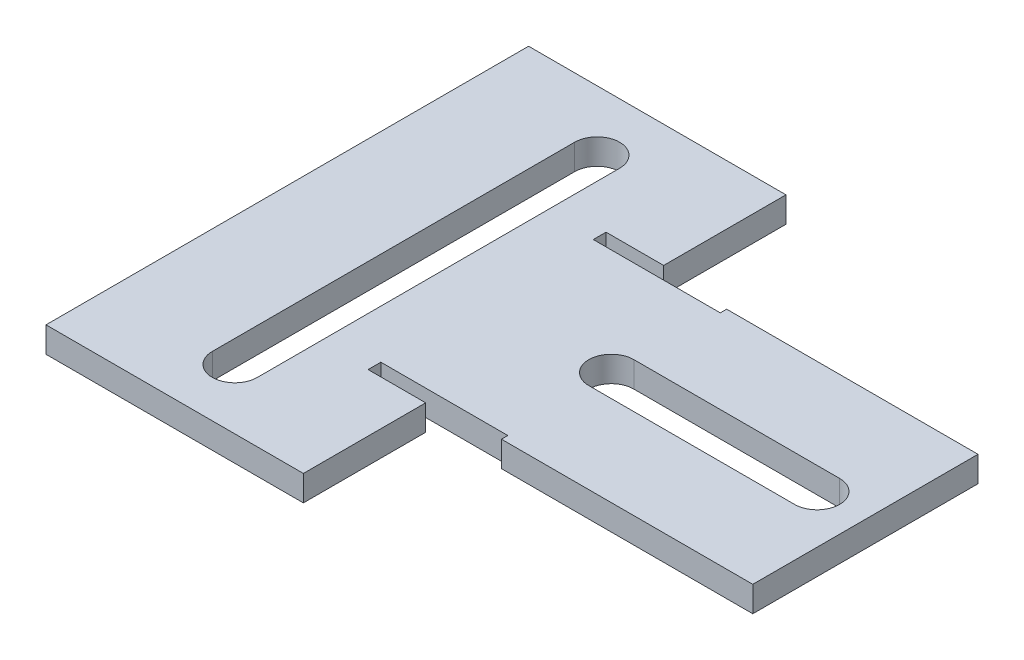
ISO-10303-21;
HEADER;
FILE_DESCRIPTION(('STEP AP214'),'2;1');
FILE_NAME('part.step','',(''),(''),'','','');
FILE_SCHEMA(('AUTOMOTIVE_DESIGN { 1 0 10303 214 1 1 1 1 }'));
ENDSEC;
DATA;
#1=APPLICATION_CONTEXT('core data for automotive mechanical design processes');
#2=APPLICATION_PROTOCOL_DEFINITION('international standard','automotive_design',2000,#1);
#3=PRODUCT_CONTEXT('',#1,'mechanical');
#4=PRODUCT('Part','Part','',(#3));
#5=PRODUCT_RELATED_PRODUCT_CATEGORY('part','',(#4));
#6=PRODUCT_DEFINITION_FORMATION('','',#4);
#7=PRODUCT_DEFINITION_CONTEXT('part definition',#1,'design');
#8=PRODUCT_DEFINITION('design','',#6,#7);
#9=PRODUCT_DEFINITION_SHAPE('','',#8);
#10=(LENGTH_UNIT() NAMED_UNIT(*) SI_UNIT(.MILLI.,.METRE.));
#11=(NAMED_UNIT(*) PLANE_ANGLE_UNIT() SI_UNIT($,.RADIAN.));
#12=(NAMED_UNIT(*) SI_UNIT($,.STERADIAN.) SOLID_ANGLE_UNIT());
#13=UNCERTAINTY_MEASURE_WITH_UNIT(LENGTH_MEASURE(1.E-05),#10,'distance_accuracy_value','');
#14=(GEOMETRIC_REPRESENTATION_CONTEXT(3) GLOBAL_UNCERTAINTY_ASSIGNED_CONTEXT((#13)) GLOBAL_UNIT_ASSIGNED_CONTEXT((#10,
#11,#12)) REPRESENTATION_CONTEXT('',''));
#15=CARTESIAN_POINT('',(0.,0.,0.));
#16=DIRECTION('',(0.,0.,1.));
#17=DIRECTION('',(1.,0.,0.));
#18=AXIS2_PLACEMENT_3D('',#15,#16,#17);
#19=CARTESIAN_POINT('',(60.7213758827366,0.,0.));
#20=DIRECTION('',(0.,1.,0.));
#21=DIRECTION('',(0.,0.,-1.));
#22=AXIS2_PLACEMENT_3D('',#19,#20,#21);
#23=CYLINDRICAL_SURFACE('',#22,7.);
#24=DIRECTION('',(0.,-1.,0.));
#25=VECTOR('',#24,1.);
#26=CARTESIAN_POINT('',(60.7213758827366,0.,-7.));
#27=LINE('',#26,#25);
#28=CARTESIAN_POINT('',(60.7213758827366,7.9375,-7.));
#29=VERTEX_POINT('',#28);
#30=CARTESIAN_POINT('',(60.7213758827366,0.,-7.));
#31=VERTEX_POINT('',#30);
#32=EDGE_CURVE('E12',#29,#31,#27,.T.);
#33=ORIENTED_EDGE('',*,*,#32,.F.);
#34=CARTESIAN_POINT('',(60.7213758827366,7.9375,0.));
#35=DIRECTION('',(0.,1.,0.));
#36=DIRECTION('',(0.,0.,-1.));
#37=AXIS2_PLACEMENT_3D('',#34,#35,#36);
#38=CIRCLE('',#37,7.);
#39=CARTESIAN_POINT('',(60.7213758827366,7.9375,7.));
#40=VERTEX_POINT('',#39);
#41=EDGE_CURVE('E270',#29,#40,#38,.T.);
#42=ORIENTED_EDGE('',*,*,#41,.T.);
#43=DIRECTION('',(0.,-1.,0.));
#44=VECTOR('',#43,1.);
#45=CARTESIAN_POINT('',(60.7213758827366,0.,7.));
#46=LINE('',#45,#44);
#47=CARTESIAN_POINT('',(60.7213758827366,0.,7.));
#48=VERTEX_POINT('',#47);
#49=EDGE_CURVE('E51',#40,#48,#46,.T.);
#50=ORIENTED_EDGE('',*,*,#49,.T.);
#51=CARTESIAN_POINT('',(60.7213758827366,0.,0.));
#52=DIRECTION('',(0.,1.,0.));
#53=DIRECTION('',(0.,0.,-1.));
#54=AXIS2_PLACEMENT_3D('',#51,#52,#53);
#55=CIRCLE('',#54,7.);
#56=EDGE_CURVE('E284',#31,#48,#55,.T.);
#57=ORIENTED_EDGE('',*,*,#56,.F.);
#58=EDGE_LOOP('',(#33,#42,#50,#57));
#59=FACE_BOUND('',#58,.T.);
#60=ADVANCED_FACE('F41',(#59),#23,.F.);
#61=CARTESIAN_POINT('',(43.6588758827366,0.,7.));
#62=DIRECTION('',(0.,0.,1.));
#63=DIRECTION('',(1.,0.,0.));
#64=AXIS2_PLACEMENT_3D('',#61,#62,#63);
#65=PLANE('',#64);
#66=ORIENTED_EDGE('',*,*,#49,.F.);
#67=DIRECTION('',(-1.,0.,0.));
#68=VECTOR('',#67,1.);
#69=CARTESIAN_POINT('',(43.6588758827366,7.9375,7.));
#70=LINE('',#69,#68);
#71=CARTESIAN_POINT('',(124.690125882737,7.93749999999999,6.99999999999999));
#72=VERTEX_POINT('',#71);
#73=EDGE_CURVE('E253',#40,#72,#70,.F.);
#74=ORIENTED_EDGE('',*,*,#73,.T.);
#75=DIRECTION('',(0.,-1.,0.));
#76=VECTOR('',#75,1.);
#77=CARTESIAN_POINT('',(124.690125882737,0.,6.99999999999999));
#78=LINE('',#77,#76);
#79=CARTESIAN_POINT('',(124.690125882737,0.,6.99999999999999));
#80=VERTEX_POINT('',#79);
#81=EDGE_CURVE('E281',#72,#80,#78,.T.);
#82=ORIENTED_EDGE('',*,*,#81,.T.);
#83=DIRECTION('',(1.,0.,0.));
#84=VECTOR('',#83,1.);
#85=CARTESIAN_POINT('',(43.6588758827366,0.,7.));
#86=LINE('',#85,#84);
#87=EDGE_CURVE('E292',#48,#80,#86,.T.);
#88=ORIENTED_EDGE('',*,*,#87,.F.);
#89=EDGE_LOOP('',(#66,#74,#82,#88));
#90=FACE_BOUND('',#89,.T.);
#91=ADVANCED_FACE('F295',(#90),#65,.F.);
#92=CARTESIAN_POINT('',(124.690125882737,0.,0.));
#93=DIRECTION('',(0.,1.,0.));
#94=DIRECTION('',(0.,0.,-1.));
#95=AXIS2_PLACEMENT_3D('',#92,#93,#94);
#96=CYLINDRICAL_SURFACE('',#95,7.);
#97=ORIENTED_EDGE('',*,*,#81,.F.);
#98=CARTESIAN_POINT('',(124.690125882737,7.93749999999999,0.));
#99=DIRECTION('',(0.,1.,0.));
#100=DIRECTION('',(0.,0.,-1.));
#101=AXIS2_PLACEMENT_3D('',#98,#99,#100);
#102=CIRCLE('',#101,7.);
#103=CARTESIAN_POINT('',(124.690125882737,7.93749999999999,-7.00000000000001));
#104=VERTEX_POINT('',#103);
#105=EDGE_CURVE('E263',#72,#104,#102,.T.);
#106=ORIENTED_EDGE('',*,*,#105,.T.);
#107=DIRECTION('',(0.,-1.,0.));
#108=VECTOR('',#107,1.);
#109=CARTESIAN_POINT('',(124.690125882737,0.,-7.00000000000001));
#110=LINE('',#109,#108);
#111=CARTESIAN_POINT('',(124.690125882737,0.,-7.00000000000001));
#112=VERTEX_POINT('',#111);
#113=EDGE_CURVE('E45',#104,#112,#110,.T.);
#114=ORIENTED_EDGE('',*,*,#113,.T.);
#115=CARTESIAN_POINT('',(124.690125882737,0.,0.));
#116=DIRECTION('',(0.,1.,0.));
#117=DIRECTION('',(0.,0.,-1.));
#118=AXIS2_PLACEMENT_3D('',#115,#116,#117);
#119=CIRCLE('',#118,7.);
#120=EDGE_CURVE('E261',#80,#112,#119,.T.);
#121=ORIENTED_EDGE('',*,*,#120,.F.);
#122=EDGE_LOOP('',(#97,#106,#114,#121));
#123=FACE_BOUND('',#122,.T.);
#124=ADVANCED_FACE('F415',(#123),#96,.F.);
#125=CARTESIAN_POINT('',(43.6588758827366,0.,-33.015625));
#126=DIRECTION('',(0.,0.,1.));
#127=DIRECTION('',(1.,0.,0.));
#128=AXIS2_PLACEMENT_3D('',#125,#126,#127);
#129=PLANE('',#128);
#130=DIRECTION('',(1.,0.,0.));
#131=VECTOR('',#130,1.);
#132=CARTESIAN_POINT('',(43.6588758827366,0.,-33.015625));
#133=LINE('',#132,#131);
#134=CARTESIAN_POINT('',(22.0937500000001,0.,-33.015625));
#135=VERTEX_POINT('',#134);
#136=CARTESIAN_POINT('',(61.5651258827365,0.,-33.015625));
#137=VERTEX_POINT('',#136);
#138=EDGE_CURVE('E238',#135,#137,#133,.T.);
#139=ORIENTED_EDGE('',*,*,#138,.F.);
#140=DIRECTION('',(0.,-1.,0.));
#141=VECTOR('',#140,1.);
#142=CARTESIAN_POINT('',(22.0937500000001,0.,-33.015625));
#143=LINE('',#142,#141);
#144=CARTESIAN_POINT('',(22.0937500000001,7.9375,-33.015625));
#145=VERTEX_POINT('',#144);
#146=EDGE_CURVE('E385',#145,#135,#143,.T.);
#147=ORIENTED_EDGE('',*,*,#146,.F.);
#148=DIRECTION('',(-1.,0.,0.));
#149=VECTOR('',#148,1.);
#150=CARTESIAN_POINT('',(43.6588758827366,7.9375,-33.015625));
#151=LINE('',#150,#149);
#152=CARTESIAN_POINT('',(61.5651258827365,7.9375,-33.015625));
#153=VERTEX_POINT('',#152);
#154=EDGE_CURVE('E108',#145,#153,#151,.F.);
#155=ORIENTED_EDGE('',*,*,#154,.T.);
#156=DIRECTION('',(0.,-1.,0.));
#157=VECTOR('',#156,1.);
#158=CARTESIAN_POINT('',(61.5651258827365,0.,-33.015625));
#159=LINE('',#158,#157);
#160=EDGE_CURVE('E59',#153,#137,#159,.T.);
#161=ORIENTED_EDGE('',*,*,#160,.T.);
#162=EDGE_LOOP('',(#139,#147,#155,#161));
#163=FACE_BOUND('',#162,.T.);
#164=ADVANCED_FACE('F417',(#163),#129,.F.);
#165=CARTESIAN_POINT('',(61.5651258827365,0.,0.));
#166=DIRECTION('',(1.,0.,0.));
#167=DIRECTION('',(0.,0.,-1.));
#168=AXIS2_PLACEMENT_3D('',#165,#166,#167);
#169=PLANE('',#168);
#170=ORIENTED_EDGE('',*,*,#160,.F.);
#171=DIRECTION('',(0.,0.,-1.));
#172=VECTOR('',#171,1.);
#173=CARTESIAN_POINT('',(61.5651258827365,7.9375,0.));
#174=LINE('',#173,#172);
#175=CARTESIAN_POINT('',(61.5651258827365,7.9375,-35.));
#176=VERTEX_POINT('',#175);
#177=EDGE_CURVE('E258',#153,#176,#174,.T.);
#178=ORIENTED_EDGE('',*,*,#177,.T.);
#179=DIRECTION('',(0.,-1.,0.));
#180=VECTOR('',#179,1.);
#181=CARTESIAN_POINT('',(61.5651258827365,0.,-35.));
#182=LINE('',#181,#180);
#183=CARTESIAN_POINT('',(61.5651258827365,0.,-35.));
#184=VERTEX_POINT('',#183);
#185=EDGE_CURVE('E278',#176,#184,#182,.T.);
#186=ORIENTED_EDGE('',*,*,#185,.T.);
#187=DIRECTION('',(0.,0.,-1.));
#188=VECTOR('',#187,1.);
#189=CARTESIAN_POINT('',(61.5651258827365,0.,0.));
#190=LINE('',#189,#188);
#191=EDGE_CURVE('E221',#137,#184,#190,.T.);
#192=ORIENTED_EDGE('',*,*,#191,.F.);
#193=EDGE_LOOP('',(#170,#178,#186,#192));
#194=FACE_BOUND('',#193,.T.);
#195=ADVANCED_FACE('F423',(#194),#169,.F.);
#196=CARTESIAN_POINT('',(43.6588758827366,0.,-35.));
#197=DIRECTION('',(0.,0.,1.));
#198=DIRECTION('',(1.,0.,0.));
#199=AXIS2_PLACEMENT_3D('',#196,#197,#198);
#200=PLANE('',#199);
#201=ORIENTED_EDGE('',*,*,#185,.F.);
#202=DIRECTION('',(-1.,0.,0.));
#203=VECTOR('',#202,1.);
#204=CARTESIAN_POINT('',(43.6588758827366,7.9375,-35.));
#205=LINE('',#204,#203);
#206=CARTESIAN_POINT('',(139.690125882737,7.93749999999999,-35.));
#207=VERTEX_POINT('',#206);
#208=EDGE_CURVE('E252',#176,#207,#205,.F.);
#209=ORIENTED_EDGE('',*,*,#208,.T.);
#210=DIRECTION('',(0.,-1.,0.));
#211=VECTOR('',#210,1.);
#212=CARTESIAN_POINT('',(139.690125882737,0.,-35.));
#213=LINE('',#212,#211);
#214=CARTESIAN_POINT('',(139.690125882737,0.,-35.));
#215=VERTEX_POINT('',#214);
#216=EDGE_CURVE('E276',#207,#215,#213,.T.);
#217=ORIENTED_EDGE('',*,*,#216,.T.);
#218=DIRECTION('',(1.,0.,0.));
#219=VECTOR('',#218,1.);
#220=CARTESIAN_POINT('',(43.6588758827366,0.,-35.));
#221=LINE('',#220,#219);
#222=EDGE_CURVE('E298',#184,#215,#221,.T.);
#223=ORIENTED_EDGE('',*,*,#222,.F.);
#224=EDGE_LOOP('',(#201,#209,#217,#223));
#225=FACE_BOUND('',#224,.T.);
#226=ADVANCED_FACE('F447',(#225),#200,.F.);
#227=CARTESIAN_POINT('',(139.690125882737,0.,0.));
#228=DIRECTION('',(1.,0.,0.));
#229=DIRECTION('',(0.,0.,-1.));
#230=AXIS2_PLACEMENT_3D('',#227,#228,#229);
#231=PLANE('',#230);
#232=ORIENTED_EDGE('',*,*,#216,.F.);
#233=DIRECTION('',(0.,0.,-1.));
#234=VECTOR('',#233,1.);
#235=CARTESIAN_POINT('',(139.690125882737,7.93749999999999,0.));
#236=LINE('',#235,#234);
#237=CARTESIAN_POINT('',(139.690125882737,7.93749999999999,35.));
#238=VERTEX_POINT('',#237);
#239=EDGE_CURVE('E248',#238,#207,#236,.T.);
#240=ORIENTED_EDGE('',*,*,#239,.F.);
#241=DIRECTION('',(0.,-1.,0.));
#242=VECTOR('',#241,1.);
#243=CARTESIAN_POINT('',(139.690125882737,0.,35.));
#244=LINE('',#243,#242);
#245=CARTESIAN_POINT('',(139.690125882737,0.,35.));
#246=VERTEX_POINT('',#245);
#247=EDGE_CURVE('E274',#238,#246,#244,.T.);
#248=ORIENTED_EDGE('',*,*,#247,.T.);
#249=DIRECTION('',(0.,0.,-1.));
#250=VECTOR('',#249,1.);
#251=CARTESIAN_POINT('',(139.690125882737,0.,0.));
#252=LINE('',#251,#250);
#253=EDGE_CURVE('E232',#246,#215,#252,.T.);
#254=ORIENTED_EDGE('',*,*,#253,.T.);
#255=EDGE_LOOP('',(#232,#240,#248,#254));
#256=FACE_BOUND('',#255,.T.);
#257=ADVANCED_FACE('F305',(#256),#231,.T.);
#258=CARTESIAN_POINT('',(43.6588758827366,0.,35.));
#259=DIRECTION('',(0.,0.,1.));
#260=DIRECTION('',(1.,0.,0.));
#261=AXIS2_PLACEMENT_3D('',#258,#259,#260);
#262=PLANE('',#261);
#263=ORIENTED_EDGE('',*,*,#247,.F.);
#264=DIRECTION('',(-1.,0.,0.));
#265=VECTOR('',#264,1.);
#266=CARTESIAN_POINT('',(43.6588758827366,7.9375,35.));
#267=LINE('',#266,#265);
#268=CARTESIAN_POINT('',(61.5651258827365,7.9375,35.));
#269=VERTEX_POINT('',#268);
#270=EDGE_CURVE('E249',#269,#238,#267,.F.);
#271=ORIENTED_EDGE('',*,*,#270,.F.);
#272=DIRECTION('',(0.,-1.,0.));
#273=VECTOR('',#272,1.);
#274=CARTESIAN_POINT('',(61.5651258827365,0.,35.));
#275=LINE('',#274,#273);
#276=CARTESIAN_POINT('',(61.5651258827365,0.,35.));
#277=VERTEX_POINT('',#276);
#278=EDGE_CURVE('E220',#269,#277,#275,.T.);
#279=ORIENTED_EDGE('',*,*,#278,.T.);
#280=DIRECTION('',(1.,0.,0.));
#281=VECTOR('',#280,1.);
#282=CARTESIAN_POINT('',(43.6588758827366,0.,35.));
#283=LINE('',#282,#281);
#284=EDGE_CURVE('E231',#277,#246,#283,.T.);
#285=ORIENTED_EDGE('',*,*,#284,.T.);
#286=EDGE_LOOP('',(#263,#271,#279,#285));
#287=FACE_BOUND('',#286,.T.);
#288=ADVANCED_FACE('F309',(#287),#262,.T.);
#289=CARTESIAN_POINT('',(61.5651258827365,0.,0.));
#290=DIRECTION('',(1.,0.,0.));
#291=DIRECTION('',(0.,0.,-1.));
#292=AXIS2_PLACEMENT_3D('',#289,#290,#291);
#293=PLANE('',#292);
#294=ORIENTED_EDGE('',*,*,#278,.F.);
#295=DIRECTION('',(0.,0.,-1.));
#296=VECTOR('',#295,1.);
#297=CARTESIAN_POINT('',(61.5651258827365,7.9375,0.));
#298=LINE('',#297,#296);
#299=CARTESIAN_POINT('',(61.5651258827365,7.9375,33.015625));
#300=VERTEX_POINT('',#299);
#301=EDGE_CURVE('E216',#269,#300,#298,.T.);
#302=ORIENTED_EDGE('',*,*,#301,.T.);
#303=DIRECTION('',(0.,-1.,0.));
#304=VECTOR('',#303,1.);
#305=CARTESIAN_POINT('',(61.5651258827365,0.,33.015625));
#306=LINE('',#305,#304);
#307=CARTESIAN_POINT('',(61.5651258827365,0.,33.015625));
#308=VERTEX_POINT('',#307);
#309=EDGE_CURVE('E211',#300,#308,#306,.T.);
#310=ORIENTED_EDGE('',*,*,#309,.T.);
#311=DIRECTION('',(0.,0.,-1.));
#312=VECTOR('',#311,1.);
#313=CARTESIAN_POINT('',(61.5651258827365,0.,0.));
#314=LINE('',#313,#312);
#315=EDGE_CURVE('E214',#277,#308,#314,.T.);
#316=ORIENTED_EDGE('',*,*,#315,.F.);
#317=EDGE_LOOP('',(#294,#302,#310,#316));
#318=FACE_BOUND('',#317,.T.);
#319=ADVANCED_FACE('F213',(#318),#293,.F.);
#320=CARTESIAN_POINT('',(43.6588758827366,0.,33.015625));
#321=DIRECTION('',(0.,0.,-1.));
#322=DIRECTION('',(-1.,0.,0.));
#323=AXIS2_PLACEMENT_3D('',#320,#321,#322);
#324=PLANE('',#323);
#325=ORIENTED_EDGE('',*,*,#309,.F.);
#326=DIRECTION('',(-1.,0.,0.));
#327=VECTOR('',#326,1.);
#328=CARTESIAN_POINT('',(43.6588758827366,7.9375,33.015625));
#329=LINE('',#328,#327);
#330=CARTESIAN_POINT('',(22.0937500000001,7.9375,33.015625));
#331=VERTEX_POINT('',#330);
#332=EDGE_CURVE('E245',#300,#331,#329,.T.);
#333=ORIENTED_EDGE('',*,*,#332,.T.);
#334=DIRECTION('',(0.,-1.,0.));
#335=VECTOR('',#334,1.);
#336=CARTESIAN_POINT('',(22.0937500000001,0.,33.015625));
#337=LINE('',#336,#335);
#338=CARTESIAN_POINT('',(22.0937500000001,0.,33.015625));
#339=VERTEX_POINT('',#338);
#340=EDGE_CURVE('E236',#331,#339,#337,.T.);
#341=ORIENTED_EDGE('',*,*,#340,.T.);
#342=DIRECTION('',(-1.,0.,0.));
#343=VECTOR('',#342,1.);
#344=CARTESIAN_POINT('',(43.6588758827366,0.,33.015625));
#345=LINE('',#344,#343);
#346=EDGE_CURVE('E227',#308,#339,#345,.T.);
#347=ORIENTED_EDGE('',*,*,#346,.F.);
#348=EDGE_LOOP('',(#325,#333,#341,#347));
#349=FACE_BOUND('',#348,.T.);
#350=ADVANCED_FACE('F234',(#349),#324,.F.);
#351=CARTESIAN_POINT('',(43.6588758827366,0.,-7.));
#352=DIRECTION('',(0.,0.,1.));
#353=DIRECTION('',(1.,0.,0.));
#354=AXIS2_PLACEMENT_3D('',#351,#352,#353);
#355=PLANE('',#354);
#356=DIRECTION('',(-1.,0.,0.));
#357=VECTOR('',#356,1.);
#358=CARTESIAN_POINT('',(43.6588758827366,7.9375,-7.));
#359=LINE('',#358,#357);
#360=EDGE_CURVE('E266',#29,#104,#359,.F.);
#361=ORIENTED_EDGE('',*,*,#360,.F.);
#362=ORIENTED_EDGE('',*,*,#32,.T.);
#363=DIRECTION('',(1.,0.,0.));
#364=VECTOR('',#363,1.);
#365=CARTESIAN_POINT('',(43.6588758827366,0.,-7.));
#366=LINE('',#365,#364);
#367=EDGE_CURVE('E293',#31,#112,#366,.T.);
#368=ORIENTED_EDGE('',*,*,#367,.T.);
#369=ORIENTED_EDGE('',*,*,#113,.F.);
#370=EDGE_LOOP('',(#361,#362,#368,#369));
#371=FACE_BOUND('',#370,.T.);
#372=ADVANCED_FACE('F411',(#371),#355,.T.);
#373=CARTESIAN_POINT('',(0.,0.,0.));
#374=DIRECTION('',(0.,1.,0.));
#375=DIRECTION('',(0.,0.,1.));
#376=AXIS2_PLACEMENT_3D('',#373,#374,#375);
#377=PLANE('',#376);
#378=ORIENTED_EDGE('',*,*,#120,.T.);
#379=ORIENTED_EDGE('',*,*,#367,.F.);
#380=ORIENTED_EDGE('',*,*,#56,.T.);
#381=ORIENTED_EDGE('',*,*,#87,.T.);
#382=EDGE_LOOP('',(#378,#379,#380,#381));
#383=FACE_BOUND('',#382,.T.);
#384=ORIENTED_EDGE('',*,*,#346,.T.);
#385=DIRECTION('',(0.,0.,1.));
#386=VECTOR('',#385,1.);
#387=CARTESIAN_POINT('',(22.0937500000001,0.,0.));
#388=LINE('',#387,#386);
#389=CARTESIAN_POINT('',(22.0937500000001,0.,36.984375));
#390=VERTEX_POINT('',#389);
#391=EDGE_CURVE('E319',#339,#390,#388,.T.);
#392=ORIENTED_EDGE('',*,*,#391,.T.);
#393=DIRECTION('',(1.,0.,0.));
#394=VECTOR('',#393,1.);
#395=CARTESIAN_POINT('',(0.,0.,36.984375));
#396=LINE('',#395,#394);
#397=CARTESIAN_POINT('',(40.,0.,36.984375));
#398=VERTEX_POINT('',#397);
#399=EDGE_CURVE('E345',#390,#398,#396,.T.);
#400=ORIENTED_EDGE('',*,*,#399,.T.);
#401=DIRECTION('',(0.,0.,-1.));
#402=VECTOR('',#401,1.);
#403=CARTESIAN_POINT('',(40.,0.,75.));
#404=LINE('',#403,#402);
#405=CARTESIAN_POINT('',(40.,0.,75.));
#406=VERTEX_POINT('',#405);
#407=EDGE_CURVE('E357',#406,#398,#404,.T.);
#408=ORIENTED_EDGE('',*,*,#407,.F.);
#409=DIRECTION('',(1.,0.,0.));
#410=VECTOR('',#409,1.);
#411=CARTESIAN_POINT('',(40.,0.,75.));
#412=LINE('',#411,#410);
#413=CARTESIAN_POINT('',(-40.,0.,75.));
#414=VERTEX_POINT('',#413);
#415=EDGE_CURVE('E365',#414,#406,#412,.T.);
#416=ORIENTED_EDGE('',*,*,#415,.F.);
#417=DIRECTION('',(0.,0.,1.));
#418=VECTOR('',#417,1.);
#419=CARTESIAN_POINT('',(-40.,0.,75.));
#420=LINE('',#419,#418);
#421=CARTESIAN_POINT('',(-40.,0.,-75.));
#422=VERTEX_POINT('',#421);
#423=EDGE_CURVE('E370',#422,#414,#420,.T.);
#424=ORIENTED_EDGE('',*,*,#423,.F.);
#425=DIRECTION('',(-1.,0.,0.));
#426=VECTOR('',#425,1.);
#427=CARTESIAN_POINT('',(40.,0.,-75.));
#428=LINE('',#427,#426);
#429=CARTESIAN_POINT('',(40.,0.,-75.));
#430=VERTEX_POINT('',#429);
#431=EDGE_CURVE('E375',#430,#422,#428,.T.);
#432=ORIENTED_EDGE('',*,*,#431,.F.);
#433=CARTESIAN_POINT('',(40.,0.,-36.984375));
#434=VERTEX_POINT('',#433);
#435=EDGE_CURVE('E358',#434,#430,#404,.T.);
#436=ORIENTED_EDGE('',*,*,#435,.F.);
#437=DIRECTION('',(-1.,0.,0.));
#438=VECTOR('',#437,1.);
#439=CARTESIAN_POINT('',(0.,0.,-36.984375));
#440=LINE('',#439,#438);
#441=CARTESIAN_POINT('',(22.0937500000001,0.,-36.984375));
#442=VERTEX_POINT('',#441);
#443=EDGE_CURVE('E342',#434,#442,#440,.T.);
#444=ORIENTED_EDGE('',*,*,#443,.T.);
#445=DIRECTION('',(0.,0.,1.));
#446=VECTOR('',#445,1.);
#447=CARTESIAN_POINT('',(22.0937500000001,0.,0.));
#448=LINE('',#447,#446);
#449=EDGE_CURVE('E339',#442,#135,#448,.T.);
#450=ORIENTED_EDGE('',*,*,#449,.T.);
#451=ORIENTED_EDGE('',*,*,#138,.T.);
#452=ORIENTED_EDGE('',*,*,#191,.T.);
#453=ORIENTED_EDGE('',*,*,#222,.T.);
#454=ORIENTED_EDGE('',*,*,#253,.F.);
#455=ORIENTED_EDGE('',*,*,#284,.F.);
#456=ORIENTED_EDGE('',*,*,#315,.T.);
#457=EDGE_LOOP('',(#384,#392,#400,#408,#416,#424,#432,#436,#444,#450,#451,#452,#453,#454,#455,#456));
#458=FACE_BOUND('',#457,.T.);
#459=CARTESIAN_POINT('',(0.,0.,-56.3114754098361));
#460=DIRECTION('',(0.,1.,0.));
#461=DIRECTION('',(0.,0.,1.));
#462=AXIS2_PLACEMENT_3D('',#459,#460,#461);
#463=CIRCLE('',#462,7.);
#464=CARTESIAN_POINT('',(6.99999999999998,0.,-56.3114754098361));
#465=VERTEX_POINT('',#464);
#466=CARTESIAN_POINT('',(-7.00000000000002,0.,-56.3114754098361));
#467=VERTEX_POINT('',#466);
#468=EDGE_CURVE('E336',#465,#467,#463,.T.);
#469=ORIENTED_EDGE('',*,*,#468,.T.);
#470=DIRECTION('',(0.,0.,1.));
#471=VECTOR('',#470,1.);
#472=CARTESIAN_POINT('',(-7.00000000000002,0.,-56.3114754098361));
#473=LINE('',#472,#471);
#474=CARTESIAN_POINT('',(-7.00000000000001,0.,56.3114754098361));
#475=VERTEX_POINT('',#474);
#476=EDGE_CURVE('E333',#467,#475,#473,.T.);
#477=ORIENTED_EDGE('',*,*,#476,.T.);
#478=CARTESIAN_POINT('',(0.,0.,56.3114754098361));
#479=DIRECTION('',(0.,1.,0.));
#480=DIRECTION('',(0.,0.,1.));
#481=AXIS2_PLACEMENT_3D('',#478,#479,#480);
#482=CIRCLE('',#481,7.);
#483=CARTESIAN_POINT('',(7.00000000000002,0.,56.3114754098361));
#484=VERTEX_POINT('',#483);
#485=EDGE_CURVE('E327',#475,#484,#482,.T.);
#486=ORIENTED_EDGE('',*,*,#485,.T.);
#487=DIRECTION('',(0.,0.,-1.));
#488=VECTOR('',#487,1.);
#489=CARTESIAN_POINT('',(6.99999999999998,0.,-56.3114754098361));
#490=LINE('',#489,#488);
#491=EDGE_CURVE('E321',#484,#465,#490,.T.);
#492=ORIENTED_EDGE('',*,*,#491,.T.);
#493=EDGE_LOOP('',(#469,#477,#486,#492));
#494=FACE_BOUND('',#493,.T.);
#495=ADVANCED_FACE('F43',(#383,#458,#494),#377,.F.);
#496=CARTESIAN_POINT('',(43.6588758827366,7.9375,0.));
#497=DIRECTION('',(0.,1.,0.));
#498=DIRECTION('',(0.,0.,-1.));
#499=AXIS2_PLACEMENT_3D('',#496,#497,#498);
#500=PLANE('',#499);
#501=ORIENTED_EDGE('',*,*,#105,.F.);
#502=ORIENTED_EDGE('',*,*,#73,.F.);
#503=ORIENTED_EDGE('',*,*,#41,.F.);
#504=ORIENTED_EDGE('',*,*,#360,.T.);
#505=EDGE_LOOP('',(#501,#502,#503,#504));
#506=FACE_BOUND('',#505,.T.);
#507=ORIENTED_EDGE('',*,*,#332,.F.);
#508=ORIENTED_EDGE('',*,*,#301,.F.);
#509=ORIENTED_EDGE('',*,*,#270,.T.);
#510=ORIENTED_EDGE('',*,*,#239,.T.);
#511=ORIENTED_EDGE('',*,*,#208,.F.);
#512=ORIENTED_EDGE('',*,*,#177,.F.);
#513=ORIENTED_EDGE('',*,*,#154,.F.);
#514=DIRECTION('',(0.,0.,1.));
#515=VECTOR('',#514,1.);
#516=CARTESIAN_POINT('',(22.0937500000001,7.9375,0.));
#517=LINE('',#516,#515);
#518=CARTESIAN_POINT('',(22.0937500000001,7.9375,-36.984375));
#519=VERTEX_POINT('',#518);
#520=EDGE_CURVE('E388',#519,#145,#517,.T.);
#521=ORIENTED_EDGE('',*,*,#520,.F.);
#522=DIRECTION('',(1.,0.,0.));
#523=VECTOR('',#522,1.);
#524=CARTESIAN_POINT('',(0.,7.9375,-36.984375));
#525=LINE('',#524,#523);
#526=CARTESIAN_POINT('',(40.,7.9375,-36.984375));
#527=VERTEX_POINT('',#526);
#528=EDGE_CURVE('E382',#527,#519,#525,.F.);
#529=ORIENTED_EDGE('',*,*,#528,.F.);
#530=DIRECTION('',(0.,0.,1.));
#531=VECTOR('',#530,1.);
#532=CARTESIAN_POINT('',(40.,7.9375,0.));
#533=LINE('',#532,#531);
#534=CARTESIAN_POINT('',(40.,7.9375,-75.));
#535=VERTEX_POINT('',#534);
#536=EDGE_CURVE('E320',#527,#535,#533,.F.);
#537=ORIENTED_EDGE('',*,*,#536,.T.);
#538=DIRECTION('',(1.,0.,0.));
#539=VECTOR('',#538,1.);
#540=CARTESIAN_POINT('',(0.,7.9375,-75.));
#541=LINE('',#540,#539);
#542=CARTESIAN_POINT('',(-40.,7.9375,-75.));
#543=VERTEX_POINT('',#542);
#544=EDGE_CURVE('E324',#535,#543,#541,.F.);
#545=ORIENTED_EDGE('',*,*,#544,.T.);
#546=DIRECTION('',(0.,0.,1.));
#547=VECTOR('',#546,1.);
#548=CARTESIAN_POINT('',(-40.,7.9375,0.));
#549=LINE('',#548,#547);
#550=CARTESIAN_POINT('',(-40.,7.9375,75.));
#551=VERTEX_POINT('',#550);
#552=EDGE_CURVE('E475',#543,#551,#549,.T.);
#553=ORIENTED_EDGE('',*,*,#552,.T.);
#554=DIRECTION('',(1.,0.,0.));
#555=VECTOR('',#554,1.);
#556=CARTESIAN_POINT('',(0.,7.9375,75.));
#557=LINE('',#556,#555);
#558=CARTESIAN_POINT('',(40.,7.9375,75.));
#559=VERTEX_POINT('',#558);
#560=EDGE_CURVE('E476',#551,#559,#557,.T.);
#561=ORIENTED_EDGE('',*,*,#560,.T.);
#562=DIRECTION('',(0.,0.,1.));
#563=VECTOR('',#562,1.);
#564=CARTESIAN_POINT('',(40.,7.9375,0.));
#565=LINE('',#564,#563);
#566=CARTESIAN_POINT('',(40.,7.9375,36.984375));
#567=VERTEX_POINT('',#566);
#568=EDGE_CURVE('E267',#559,#567,#565,.F.);
#569=ORIENTED_EDGE('',*,*,#568,.T.);
#570=DIRECTION('',(1.,0.,0.));
#571=VECTOR('',#570,1.);
#572=CARTESIAN_POINT('',(0.,7.9375,36.984375));
#573=LINE('',#572,#571);
#574=CARTESIAN_POINT('',(22.0937500000001,7.9375,36.984375));
#575=VERTEX_POINT('',#574);
#576=EDGE_CURVE('E354',#575,#567,#573,.T.);
#577=ORIENTED_EDGE('',*,*,#576,.F.);
#578=DIRECTION('',(0.,0.,1.));
#579=VECTOR('',#578,1.);
#580=CARTESIAN_POINT('',(22.0937500000001,7.9375,0.));
#581=LINE('',#580,#579);
#582=EDGE_CURVE('E316',#331,#575,#581,.T.);
#583=ORIENTED_EDGE('',*,*,#582,.F.);
#584=EDGE_LOOP('',(#507,#508,#509,#510,#511,#512,#513,#521,#529,#537,#545,#553,#561,#569,#577,#583));
#585=FACE_BOUND('',#584,.T.);
#586=CARTESIAN_POINT('',(0.,7.9375,-56.3114754098361));
#587=DIRECTION('',(0.,1.,0.));
#588=DIRECTION('',(0.,0.,1.));
#589=AXIS2_PLACEMENT_3D('',#586,#587,#588);
#590=CIRCLE('',#589,7.);
#591=CARTESIAN_POINT('',(6.99999999999998,7.9375,-56.3114754098361));
#592=VERTEX_POINT('',#591);
#593=CARTESIAN_POINT('',(-7.00000000000002,7.9375,-56.3114754098361));
#594=VERTEX_POINT('',#593);
#595=EDGE_CURVE('E393',#592,#594,#590,.T.);
#596=ORIENTED_EDGE('',*,*,#595,.F.);
#597=DIRECTION('',(0.,0.,1.));
#598=VECTOR('',#597,1.);
#599=CARTESIAN_POINT('',(7.00000000000002,7.9375,0.));
#600=LINE('',#599,#598);
#601=CARTESIAN_POINT('',(7.00000000000002,7.9375,56.3114754098361));
#602=VERTEX_POINT('',#601);
#603=EDGE_CURVE('E408',#602,#592,#600,.F.);
#604=ORIENTED_EDGE('',*,*,#603,.F.);
#605=CARTESIAN_POINT('',(0.,7.9375,56.3114754098361));
#606=DIRECTION('',(0.,1.,0.));
#607=DIRECTION('',(0.,0.,1.));
#608=AXIS2_PLACEMENT_3D('',#605,#606,#607);
#609=CIRCLE('',#608,7.);
#610=CARTESIAN_POINT('',(-7.00000000000001,7.9375,56.3114754098361));
#611=VERTEX_POINT('',#610);
#612=EDGE_CURVE('E403',#611,#602,#609,.T.);
#613=ORIENTED_EDGE('',*,*,#612,.F.);
#614=DIRECTION('',(0.,0.,1.));
#615=VECTOR('',#614,1.);
#616=CARTESIAN_POINT('',(-7.00000000000002,7.9375,0.));
#617=LINE('',#616,#615);
#618=EDGE_CURVE('E398',#594,#611,#617,.T.);
#619=ORIENTED_EDGE('',*,*,#618,.F.);
#620=EDGE_LOOP('',(#596,#604,#613,#619));
#621=FACE_BOUND('',#620,.T.);
#622=ADVANCED_FACE('F311',(#506,#585,#621),#500,.T.);
#623=CARTESIAN_POINT('',(6.99999999999998,0.,-56.3114754098361));
#624=DIRECTION('',(1.,0.,0.));
#625=DIRECTION('',(0.,0.,-1.));
#626=AXIS2_PLACEMENT_3D('',#623,#624,#625);
#627=PLANE('',#626);
#628=DIRECTION('',(0.,-1.,0.));
#629=VECTOR('',#628,1.);
#630=CARTESIAN_POINT('',(7.00000000000002,0.,56.3114754098361));
#631=LINE('',#630,#629);
#632=EDGE_CURVE('E401',#602,#484,#631,.T.);
#633=ORIENTED_EDGE('',*,*,#632,.F.);
#634=ORIENTED_EDGE('',*,*,#603,.T.);
#635=DIRECTION('',(0.,-1.,0.));
#636=VECTOR('',#635,1.);
#637=CARTESIAN_POINT('',(6.99999999999998,0.,-56.3114754098361));
#638=LINE('',#637,#636);
#639=EDGE_CURVE('E406',#592,#465,#638,.T.);
#640=ORIENTED_EDGE('',*,*,#639,.T.);
#641=ORIENTED_EDGE('',*,*,#491,.F.);
#642=EDGE_LOOP('',(#633,#634,#640,#641));
#643=FACE_BOUND('',#642,.T.);
#644=ADVANCED_FACE('F596',(#643),#627,.F.);
#645=CARTESIAN_POINT('',(0.,0.,56.3114754098361));
#646=DIRECTION('',(0.,1.,0.));
#647=DIRECTION('',(0.,0.,1.));
#648=AXIS2_PLACEMENT_3D('',#645,#646,#647);
#649=CYLINDRICAL_SURFACE('',#648,7.);
#650=DIRECTION('',(0.,-1.,0.));
#651=VECTOR('',#650,1.);
#652=CARTESIAN_POINT('',(-7.00000000000001,0.,56.3114754098361));
#653=LINE('',#652,#651);
#654=EDGE_CURVE('E396',#611,#475,#653,.T.);
#655=ORIENTED_EDGE('',*,*,#654,.F.);
#656=ORIENTED_EDGE('',*,*,#612,.T.);
#657=ORIENTED_EDGE('',*,*,#632,.T.);
#658=ORIENTED_EDGE('',*,*,#485,.F.);
#659=EDGE_LOOP('',(#655,#656,#657,#658));
#660=FACE_BOUND('',#659,.T.);
#661=ADVANCED_FACE('F585',(#660),#649,.F.);
#662=CARTESIAN_POINT('',(-7.00000000000002,0.,-56.3114754098361));
#663=DIRECTION('',(-1.,0.,0.));
#664=DIRECTION('',(0.,0.,1.));
#665=AXIS2_PLACEMENT_3D('',#662,#663,#664);
#666=PLANE('',#665);
#667=ORIENTED_EDGE('',*,*,#618,.T.);
#668=ORIENTED_EDGE('',*,*,#654,.T.);
#669=ORIENTED_EDGE('',*,*,#476,.F.);
#670=DIRECTION('',(0.,-1.,0.));
#671=VECTOR('',#670,1.);
#672=CARTESIAN_POINT('',(-7.00000000000002,0.,-56.3114754098361));
#673=LINE('',#672,#671);
#674=EDGE_CURVE('E391',#594,#467,#673,.T.);
#675=ORIENTED_EDGE('',*,*,#674,.F.);
#676=EDGE_LOOP('',(#667,#668,#669,#675));
#677=FACE_BOUND('',#676,.T.);
#678=ADVANCED_FACE('F574',(#677),#666,.F.);
#679=CARTESIAN_POINT('',(0.,0.,-56.3114754098361));
#680=DIRECTION('',(0.,1.,0.));
#681=DIRECTION('',(0.,0.,1.));
#682=AXIS2_PLACEMENT_3D('',#679,#680,#681);
#683=CYLINDRICAL_SURFACE('',#682,7.);
#684=ORIENTED_EDGE('',*,*,#639,.F.);
#685=ORIENTED_EDGE('',*,*,#595,.T.);
#686=ORIENTED_EDGE('',*,*,#674,.T.);
#687=ORIENTED_EDGE('',*,*,#468,.F.);
#688=EDGE_LOOP('',(#684,#685,#686,#687));
#689=FACE_BOUND('',#688,.T.);
#690=ADVANCED_FACE('F564',(#689),#683,.F.);
#691=CARTESIAN_POINT('',(22.0937500000001,0.,0.));
#692=DIRECTION('',(-1.,0.,0.));
#693=DIRECTION('',(0.,0.,1.));
#694=AXIS2_PLACEMENT_3D('',#691,#692,#693);
#695=PLANE('',#694);
#696=DIRECTION('',(0.,-1.,0.));
#697=VECTOR('',#696,1.);
#698=CARTESIAN_POINT('',(22.0937500000001,0.,-36.984375));
#699=LINE('',#698,#697);
#700=EDGE_CURVE('E380',#519,#442,#699,.T.);
#701=ORIENTED_EDGE('',*,*,#700,.F.);
#702=ORIENTED_EDGE('',*,*,#520,.T.);
#703=ORIENTED_EDGE('',*,*,#146,.T.);
#704=ORIENTED_EDGE('',*,*,#449,.F.);
#705=EDGE_LOOP('',(#701,#702,#703,#704));
#706=FACE_BOUND('',#705,.T.);
#707=ADVANCED_FACE('F459',(#706),#695,.F.);
#708=CARTESIAN_POINT('',(0.,0.,-36.984375));
#709=DIRECTION('',(0.,0.,-1.));
#710=DIRECTION('',(-1.,0.,0.));
#711=AXIS2_PLACEMENT_3D('',#708,#709,#710);
#712=PLANE('',#711);
#713=DIRECTION('',(0.,-1.,0.));
#714=VECTOR('',#713,1.);
#715=CARTESIAN_POINT('',(40.,0.,-36.984375));
#716=LINE('',#715,#714);
#717=EDGE_CURVE('E362',#527,#434,#716,.T.);
#718=ORIENTED_EDGE('',*,*,#717,.F.);
#719=ORIENTED_EDGE('',*,*,#528,.T.);
#720=ORIENTED_EDGE('',*,*,#700,.T.);
#721=ORIENTED_EDGE('',*,*,#443,.F.);
#722=EDGE_LOOP('',(#718,#719,#720,#721));
#723=FACE_BOUND('',#722,.T.);
#724=ADVANCED_FACE('F462',(#723),#712,.F.);
#725=CARTESIAN_POINT('',(40.,0.,75.));
#726=DIRECTION('',(1.,0.,0.));
#727=DIRECTION('',(0.,0.,-1.));
#728=AXIS2_PLACEMENT_3D('',#725,#726,#727);
#729=PLANE('',#728);
#730=DIRECTION('',(0.,-1.,0.));
#731=VECTOR('',#730,1.);
#732=CARTESIAN_POINT('',(40.,0.,-75.));
#733=LINE('',#732,#731);
#734=EDGE_CURVE('E361',#535,#430,#733,.T.);
#735=ORIENTED_EDGE('',*,*,#734,.F.);
#736=ORIENTED_EDGE('',*,*,#536,.F.);
#737=ORIENTED_EDGE('',*,*,#717,.T.);
#738=ORIENTED_EDGE('',*,*,#435,.T.);
#739=EDGE_LOOP('',(#735,#736,#737,#738));
#740=FACE_BOUND('',#739,.T.);
#741=ADVANCED_FACE('F467',(#740),#729,.T.);
#742=CARTESIAN_POINT('',(40.,0.,-75.));
#743=DIRECTION('',(0.,0.,-1.));
#744=DIRECTION('',(-1.,0.,0.));
#745=AXIS2_PLACEMENT_3D('',#742,#743,#744);
#746=PLANE('',#745);
#747=DIRECTION('',(0.,-1.,0.));
#748=VECTOR('',#747,1.);
#749=CARTESIAN_POINT('',(-40.,0.,-75.));
#750=LINE('',#749,#748);
#751=EDGE_CURVE('E373',#543,#422,#750,.T.);
#752=ORIENTED_EDGE('',*,*,#751,.F.);
#753=ORIENTED_EDGE('',*,*,#544,.F.);
#754=ORIENTED_EDGE('',*,*,#734,.T.);
#755=ORIENTED_EDGE('',*,*,#431,.T.);
#756=EDGE_LOOP('',(#752,#753,#754,#755));
#757=FACE_BOUND('',#756,.T.);
#758=ADVANCED_FACE('F473',(#757),#746,.T.);
#759=CARTESIAN_POINT('',(-40.,0.,75.));
#760=DIRECTION('',(-1.,0.,0.));
#761=DIRECTION('',(0.,0.,1.));
#762=AXIS2_PLACEMENT_3D('',#759,#760,#761);
#763=PLANE('',#762);
#764=DIRECTION('',(0.,-1.,0.));
#765=VECTOR('',#764,1.);
#766=CARTESIAN_POINT('',(-40.,0.,75.));
#767=LINE('',#766,#765);
#768=EDGE_CURVE('E368',#551,#414,#767,.T.);
#769=ORIENTED_EDGE('',*,*,#768,.F.);
#770=ORIENTED_EDGE('',*,*,#552,.F.);
#771=ORIENTED_EDGE('',*,*,#751,.T.);
#772=ORIENTED_EDGE('',*,*,#423,.T.);
#773=EDGE_LOOP('',(#769,#770,#771,#772));
#774=FACE_BOUND('',#773,.T.);
#775=ADVANCED_FACE('F496',(#774),#763,.T.);
#776=CARTESIAN_POINT('',(40.,0.,75.));
#777=DIRECTION('',(0.,0.,1.));
#778=DIRECTION('',(1.,0.,0.));
#779=AXIS2_PLACEMENT_3D('',#776,#777,#778);
#780=PLANE('',#779);
#781=DIRECTION('',(0.,-1.,0.));
#782=VECTOR('',#781,1.);
#783=CARTESIAN_POINT('',(40.,0.,75.));
#784=LINE('',#783,#782);
#785=EDGE_CURVE('E363',#559,#406,#784,.T.);
#786=ORIENTED_EDGE('',*,*,#785,.F.);
#787=ORIENTED_EDGE('',*,*,#560,.F.);
#788=ORIENTED_EDGE('',*,*,#768,.T.);
#789=ORIENTED_EDGE('',*,*,#415,.T.);
#790=EDGE_LOOP('',(#786,#787,#788,#789));
#791=FACE_BOUND('',#790,.T.);
#792=ADVANCED_FACE('F493',(#791),#780,.T.);
#793=DIRECTION('',(0.,-1.,0.));
#794=VECTOR('',#793,1.);
#795=CARTESIAN_POINT('',(40.,0.,36.984375));
#796=LINE('',#795,#794);
#797=EDGE_CURVE('E352',#567,#398,#796,.T.);
#798=ORIENTED_EDGE('',*,*,#797,.F.);
#799=ORIENTED_EDGE('',*,*,#568,.F.);
#800=ORIENTED_EDGE('',*,*,#785,.T.);
#801=ORIENTED_EDGE('',*,*,#407,.T.);
#802=EDGE_LOOP('',(#798,#799,#800,#801));
#803=FACE_BOUND('',#802,.T.);
#804=ADVANCED_FACE('F491',(#803),#729,.T.);
#805=CARTESIAN_POINT('',(0.,0.,36.984375));
#806=DIRECTION('',(0.,0.,1.));
#807=DIRECTION('',(1.,0.,0.));
#808=AXIS2_PLACEMENT_3D('',#805,#806,#807);
#809=PLANE('',#808);
#810=DIRECTION('',(0.,-1.,0.));
#811=VECTOR('',#810,1.);
#812=CARTESIAN_POINT('',(22.0937500000001,0.,36.984375));
#813=LINE('',#812,#811);
#814=EDGE_CURVE('E349',#575,#390,#813,.T.);
#815=ORIENTED_EDGE('',*,*,#814,.F.);
#816=ORIENTED_EDGE('',*,*,#576,.T.);
#817=ORIENTED_EDGE('',*,*,#797,.T.);
#818=ORIENTED_EDGE('',*,*,#399,.F.);
#819=EDGE_LOOP('',(#815,#816,#817,#818));
#820=FACE_BOUND('',#819,.T.);
#821=ADVANCED_FACE('F486',(#820),#809,.F.);
#822=CARTESIAN_POINT('',(22.0937500000001,0.,0.));
#823=DIRECTION('',(-1.,0.,0.));
#824=DIRECTION('',(0.,0.,1.));
#825=AXIS2_PLACEMENT_3D('',#822,#823,#824);
#826=PLANE('',#825);
#827=ORIENTED_EDGE('',*,*,#340,.F.);
#828=ORIENTED_EDGE('',*,*,#582,.T.);
#829=ORIENTED_EDGE('',*,*,#814,.T.);
#830=ORIENTED_EDGE('',*,*,#391,.F.);
#831=EDGE_LOOP('',(#827,#828,#829,#830));
#832=FACE_BOUND('',#831,.T.);
#833=ADVANCED_FACE('F318',(#832),#826,.F.);
#834=CLOSED_SHELL('',(#60,#91,#124,#164,#195,#226,#257,#288,#319,#350,#372,#495,#622,#644,#661,
#678,#690,#707,#724,#741,#758,#775,#792,#804,#821,#833));
#835=MANIFOLD_SOLID_BREP('B2',#834);
#836=ADVANCED_BREP_SHAPE_REPRESENTATION('',(#18,#835),#14);
#837=SHAPE_DEFINITION_REPRESENTATION(#9,#836);
ENDSEC;
END-ISO-10303-21;
